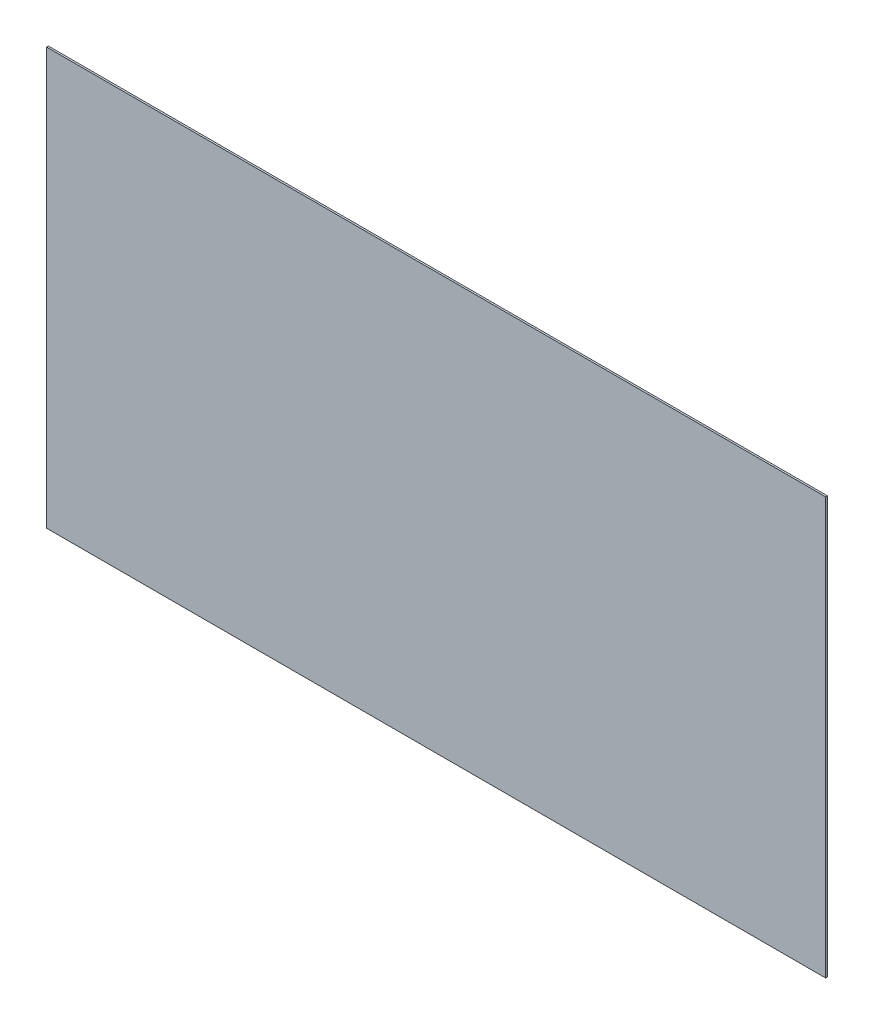
ISO-10303-21;
HEADER;
FILE_DESCRIPTION(('STEP AP214'),'2;1');
FILE_NAME('part.step','',(''),(''),'','','');
FILE_SCHEMA(('AUTOMOTIVE_DESIGN { 1 0 10303 214 1 1 1 1 }'));
ENDSEC;
DATA;
#1=APPLICATION_CONTEXT('core data for automotive mechanical design processes');
#2=APPLICATION_PROTOCOL_DEFINITION('international standard','automotive_design',2000,#1);
#3=PRODUCT_CONTEXT('',#1,'mechanical');
#4=PRODUCT('Part','Part','',(#3));
#5=PRODUCT_RELATED_PRODUCT_CATEGORY('part','',(#4));
#6=PRODUCT_DEFINITION_FORMATION('','',#4);
#7=PRODUCT_DEFINITION_CONTEXT('part definition',#1,'design');
#8=PRODUCT_DEFINITION('design','',#6,#7);
#9=PRODUCT_DEFINITION_SHAPE('','',#8);
#10=(LENGTH_UNIT() NAMED_UNIT(*) SI_UNIT(.MILLI.,.METRE.));
#11=(NAMED_UNIT(*) PLANE_ANGLE_UNIT() SI_UNIT($,.RADIAN.));
#12=(NAMED_UNIT(*) SI_UNIT($,.STERADIAN.) SOLID_ANGLE_UNIT());
#13=UNCERTAINTY_MEASURE_WITH_UNIT(LENGTH_MEASURE(1.E-05),#10,'distance_accuracy_value','');
#14=(GEOMETRIC_REPRESENTATION_CONTEXT(3) GLOBAL_UNCERTAINTY_ASSIGNED_CONTEXT((#13)) GLOBAL_UNIT_ASSIGNED_CONTEXT((#10,
#11,#12)) REPRESENTATION_CONTEXT('',''));
#15=CARTESIAN_POINT('',(0.,0.,0.));
#16=DIRECTION('',(0.,0.,1.));
#17=DIRECTION('',(1.,0.,0.));
#18=AXIS2_PLACEMENT_3D('',#15,#16,#17);
#19=CARTESIAN_POINT('',(21.5,-11.5,0.1));
#20=DIRECTION('',(-1.,0.,0.));
#21=DIRECTION('',(0.,-1.,0.));
#22=AXIS2_PLACEMENT_3D('',#19,#20,#21);
#23=PLANE('',#22);
#24=DIRECTION('',(0.,1.,0.));
#25=VECTOR('',#24,1.);
#26=CARTESIAN_POINT('',(21.5,-11.5,0.));
#27=LINE('',#26,#25);
#28=CARTESIAN_POINT('',(21.5,-11.5,0.));
#29=VERTEX_POINT('',#28);
#30=CARTESIAN_POINT('',(21.5,11.5,0.));
#31=VERTEX_POINT('',#30);
#32=EDGE_CURVE('E106',#29,#31,#27,.T.);
#33=ORIENTED_EDGE('',*,*,#32,.T.);
#34=DIRECTION('',(0.,0.,-1.));
#35=VECTOR('',#34,1.);
#36=CARTESIAN_POINT('',(21.5,11.5,0.1));
#37=LINE('',#36,#35);
#38=CARTESIAN_POINT('',(21.5,11.5,0.1));
#39=VERTEX_POINT('',#38);
#40=EDGE_CURVE('E11',#39,#31,#37,.T.);
#41=ORIENTED_EDGE('',*,*,#40,.F.);
#42=DIRECTION('',(0.,1.,0.));
#43=VECTOR('',#42,1.);
#44=CARTESIAN_POINT('',(21.5,-11.5,0.1));
#45=LINE('',#44,#43);
#46=CARTESIAN_POINT('',(21.5,-11.5,0.1));
#47=VERTEX_POINT('',#46);
#48=EDGE_CURVE('E94',#47,#39,#45,.T.);
#49=ORIENTED_EDGE('',*,*,#48,.F.);
#50=DIRECTION('',(0.,0.,-1.));
#51=VECTOR('',#50,1.);
#52=CARTESIAN_POINT('',(21.5,-11.5,0.1));
#53=LINE('',#52,#51);
#54=EDGE_CURVE('E102',#47,#29,#53,.T.);
#55=ORIENTED_EDGE('',*,*,#54,.T.);
#56=EDGE_LOOP('',(#33,#41,#49,#55));
#57=FACE_BOUND('',#56,.T.);
#58=ADVANCED_FACE('F43',(#57),#23,.F.);
#59=CARTESIAN_POINT('',(-21.5,11.5,0.1));
#60=DIRECTION('',(0.,-1.,0.));
#61=DIRECTION('',(0.,0.,-1.));
#62=AXIS2_PLACEMENT_3D('',#59,#60,#61);
#63=PLANE('',#62);
#64=DIRECTION('',(-1.,0.,0.));
#65=VECTOR('',#64,1.);
#66=CARTESIAN_POINT('',(-21.5,11.5,0.));
#67=LINE('',#66,#65);
#68=CARTESIAN_POINT('',(-21.5,11.5,0.));
#69=VERTEX_POINT('',#68);
#70=EDGE_CURVE('E98',#31,#69,#67,.T.);
#71=ORIENTED_EDGE('',*,*,#70,.T.);
#72=DIRECTION('',(0.,0.,-1.));
#73=VECTOR('',#72,1.);
#74=CARTESIAN_POINT('',(-21.5,11.5,0.1));
#75=LINE('',#74,#73);
#76=CARTESIAN_POINT('',(-21.5,11.5,0.1));
#77=VERTEX_POINT('',#76);
#78=EDGE_CURVE('E51',#77,#69,#75,.T.);
#79=ORIENTED_EDGE('',*,*,#78,.F.);
#80=DIRECTION('',(-1.,0.,0.));
#81=VECTOR('',#80,1.);
#82=CARTESIAN_POINT('',(-21.5,11.5,0.1));
#83=LINE('',#82,#81);
#84=EDGE_CURVE('E89',#39,#77,#83,.T.);
#85=ORIENTED_EDGE('',*,*,#84,.F.);
#86=ORIENTED_EDGE('',*,*,#40,.T.);
#87=EDGE_LOOP('',(#71,#79,#85,#86));
#88=FACE_BOUND('',#87,.T.);
#89=ADVANCED_FACE('F97',(#88),#63,.F.);
#90=CARTESIAN_POINT('',(-21.5,-11.5,0.1));
#91=DIRECTION('',(1.,0.,0.));
#92=DIRECTION('',(0.,0.,-1.));
#93=AXIS2_PLACEMENT_3D('',#90,#91,#92);
#94=PLANE('',#93);
#95=DIRECTION('',(0.,-1.,0.));
#96=VECTOR('',#95,1.);
#97=CARTESIAN_POINT('',(-21.5,-11.5,0.));
#98=LINE('',#97,#96);
#99=CARTESIAN_POINT('',(-21.5,-11.5,0.));
#100=VERTEX_POINT('',#99);
#101=EDGE_CURVE('E76',#69,#100,#98,.T.);
#102=ORIENTED_EDGE('',*,*,#101,.T.);
#103=DIRECTION('',(0.,0.,-1.));
#104=VECTOR('',#103,1.);
#105=CARTESIAN_POINT('',(-21.5,-11.5,0.1));
#106=LINE('',#105,#104);
#107=CARTESIAN_POINT('',(-21.5,-11.5,0.1));
#108=VERTEX_POINT('',#107);
#109=EDGE_CURVE('E99',#108,#100,#106,.T.);
#110=ORIENTED_EDGE('',*,*,#109,.F.);
#111=DIRECTION('',(0.,-1.,0.));
#112=VECTOR('',#111,1.);
#113=CARTESIAN_POINT('',(-21.5,-11.5,0.1));
#114=LINE('',#113,#112);
#115=EDGE_CURVE('E92',#77,#108,#114,.T.);
#116=ORIENTED_EDGE('',*,*,#115,.F.);
#117=ORIENTED_EDGE('',*,*,#78,.T.);
#118=EDGE_LOOP('',(#102,#110,#116,#117));
#119=FACE_BOUND('',#118,.T.);
#120=ADVANCED_FACE('F100',(#119),#94,.F.);
#121=CARTESIAN_POINT('',(-21.5,-11.5,0.1));
#122=DIRECTION('',(0.,1.,0.));
#123=DIRECTION('',(-1.,0.,0.));
#124=AXIS2_PLACEMENT_3D('',#121,#122,#123);
#125=PLANE('',#124);
#126=DIRECTION('',(1.,0.,0.));
#127=VECTOR('',#126,1.);
#128=CARTESIAN_POINT('',(-21.5,-11.5,0.));
#129=LINE('',#128,#127);
#130=EDGE_CURVE('E82',#100,#29,#129,.T.);
#131=ORIENTED_EDGE('',*,*,#130,.T.);
#132=ORIENTED_EDGE('',*,*,#54,.F.);
#133=DIRECTION('',(1.,0.,0.));
#134=VECTOR('',#133,1.);
#135=CARTESIAN_POINT('',(-21.5,-11.5,0.1));
#136=LINE('',#135,#134);
#137=EDGE_CURVE('E59',#108,#47,#136,.T.);
#138=ORIENTED_EDGE('',*,*,#137,.F.);
#139=ORIENTED_EDGE('',*,*,#109,.T.);
#140=EDGE_LOOP('',(#131,#132,#138,#139));
#141=FACE_BOUND('',#140,.T.);
#142=ADVANCED_FACE('F113',(#141),#125,.F.);
#143=CARTESIAN_POINT('',(0.,0.,0.1));
#144=DIRECTION('',(0.,0.,-1.));
#145=DIRECTION('',(-1.,0.,0.));
#146=AXIS2_PLACEMENT_3D('',#143,#144,#145);
#147=PLANE('',#146);
#148=ORIENTED_EDGE('',*,*,#48,.T.);
#149=ORIENTED_EDGE('',*,*,#84,.T.);
#150=ORIENTED_EDGE('',*,*,#115,.T.);
#151=ORIENTED_EDGE('',*,*,#137,.T.);
#152=EDGE_LOOP('',(#148,#149,#150,#151));
#153=FACE_BOUND('',#152,.T.);
#154=ADVANCED_FACE('F90',(#153),#147,.F.);
#155=CARTESIAN_POINT('',(0.,0.,0.));
#156=DIRECTION('',(0.,0.,-1.));
#157=DIRECTION('',(-1.,0.,0.));
#158=AXIS2_PLACEMENT_3D('',#155,#156,#157);
#159=PLANE('',#158);
#160=ORIENTED_EDGE('',*,*,#32,.F.);
#161=ORIENTED_EDGE('',*,*,#130,.F.);
#162=ORIENTED_EDGE('',*,*,#101,.F.);
#163=ORIENTED_EDGE('',*,*,#70,.F.);
#164=EDGE_LOOP('',(#160,#161,#162,#163));
#165=FACE_BOUND('',#164,.T.);
#166=ADVANCED_FACE('F116',(#165),#159,.T.);
#167=CLOSED_SHELL('',(#58,#89,#120,#142,#154,#166));
#168=MANIFOLD_SOLID_BREP('B2',#167);
#169=ADVANCED_BREP_SHAPE_REPRESENTATION('',(#18,#168),#14);
#170=SHAPE_DEFINITION_REPRESENTATION(#9,#169);
ENDSEC;
END-ISO-10303-21;
